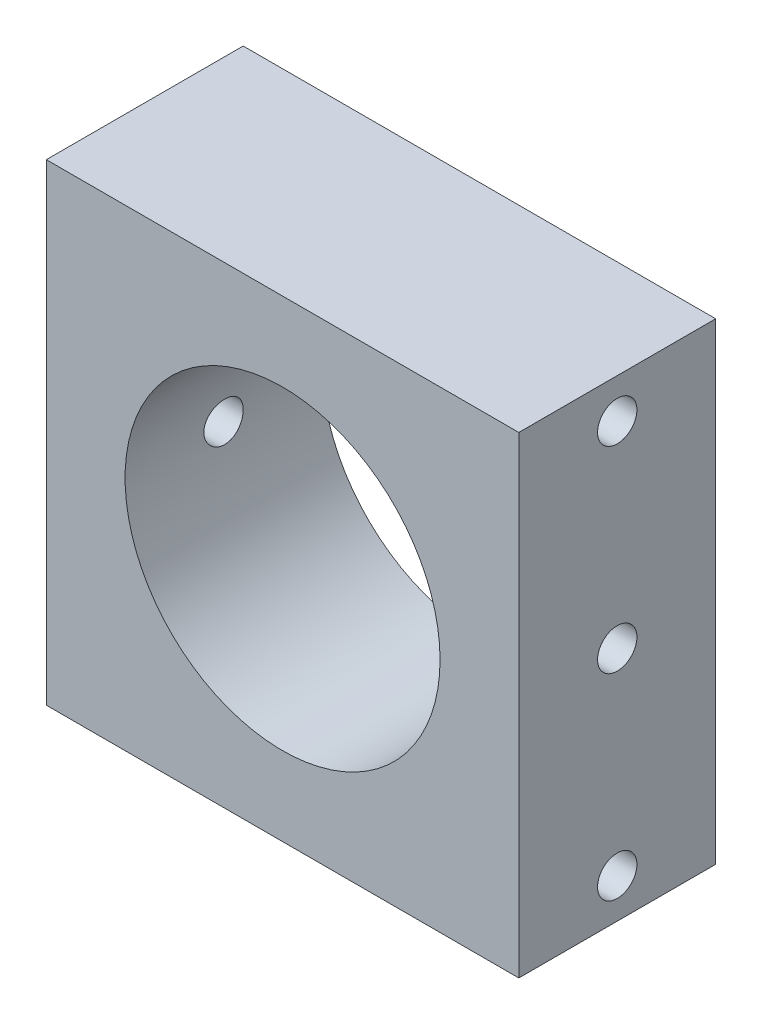
ISO-10303-21;
HEADER;
FILE_DESCRIPTION(('STEP AP214'),'2;1');
FILE_NAME('part.step','',(''),(''),'','','');
FILE_SCHEMA(('AUTOMOTIVE_DESIGN { 1 0 10303 214 1 1 1 1 }'));
ENDSEC;
DATA;
#1=APPLICATION_CONTEXT('core data for automotive mechanical design processes');
#2=APPLICATION_PROTOCOL_DEFINITION('international standard','automotive_design',2000,#1);
#3=PRODUCT_CONTEXT('',#1,'mechanical');
#4=PRODUCT('Part','Part','',(#3));
#5=PRODUCT_RELATED_PRODUCT_CATEGORY('part','',(#4));
#6=PRODUCT_DEFINITION_FORMATION('','',#4);
#7=PRODUCT_DEFINITION_CONTEXT('part definition',#1,'design');
#8=PRODUCT_DEFINITION('design','',#6,#7);
#9=PRODUCT_DEFINITION_SHAPE('','',#8);
#10=(LENGTH_UNIT() NAMED_UNIT(*) SI_UNIT(.MILLI.,.METRE.));
#11=(NAMED_UNIT(*) PLANE_ANGLE_UNIT() SI_UNIT($,.RADIAN.));
#12=(NAMED_UNIT(*) SI_UNIT($,.STERADIAN.) SOLID_ANGLE_UNIT());
#13=UNCERTAINTY_MEASURE_WITH_UNIT(LENGTH_MEASURE(1.E-05),#10,'distance_accuracy_value','');
#14=(GEOMETRIC_REPRESENTATION_CONTEXT(3) GLOBAL_UNCERTAINTY_ASSIGNED_CONTEXT((#13)) GLOBAL_UNIT_ASSIGNED_CONTEXT((#10,
#11,#12)) REPRESENTATION_CONTEXT('',''));
#15=CARTESIAN_POINT('',(0.,0.,0.));
#16=DIRECTION('',(0.,0.,1.));
#17=DIRECTION('',(1.,0.,0.));
#18=AXIS2_PLACEMENT_3D('',#15,#16,#17);
#19=CARTESIAN_POINT('',(0.,-30.,25.));
#20=DIRECTION('',(0.,1.,0.));
#21=DIRECTION('',(0.,0.,1.));
#22=AXIS2_PLACEMENT_3D('',#19,#20,#21);
#23=PLANE('',#22);
#24=DIRECTION('',(1.,0.,0.));
#25=VECTOR('',#24,1.);
#26=CARTESIAN_POINT('',(0.,-30.,0.));
#27=LINE('',#26,#25);
#28=CARTESIAN_POINT('',(-30.,-30.,0.));
#29=VERTEX_POINT('',#28);
#30=CARTESIAN_POINT('',(30.,-30.,0.));
#31=VERTEX_POINT('',#30);
#32=EDGE_CURVE('E120',#29,#31,#27,.T.);
#33=ORIENTED_EDGE('',*,*,#32,.T.);
#34=DIRECTION('',(0.,0.,-1.));
#35=VECTOR('',#34,1.);
#36=CARTESIAN_POINT('',(30.,-30.,25.));
#37=LINE('',#36,#35);
#38=CARTESIAN_POINT('',(30.,-30.,25.));
#39=VERTEX_POINT('',#38);
#40=EDGE_CURVE('E11',#39,#31,#37,.T.);
#41=ORIENTED_EDGE('',*,*,#40,.F.);
#42=DIRECTION('',(1.,0.,0.));
#43=VECTOR('',#42,1.);
#44=CARTESIAN_POINT('',(0.,-30.,25.));
#45=LINE('',#44,#43);
#46=CARTESIAN_POINT('',(-30.,-30.,25.));
#47=VERTEX_POINT('',#46);
#48=EDGE_CURVE('E102',#47,#39,#45,.T.);
#49=ORIENTED_EDGE('',*,*,#48,.F.);
#50=DIRECTION('',(0.,0.,-1.));
#51=VECTOR('',#50,1.);
#52=CARTESIAN_POINT('',(-30.,-30.,25.));
#53=LINE('',#52,#51);
#54=EDGE_CURVE('E68',#47,#29,#53,.T.);
#55=ORIENTED_EDGE('',*,*,#54,.T.);
#56=EDGE_LOOP('',(#33,#41,#49,#55));
#57=FACE_BOUND('',#56,.T.);
#58=ADVANCED_FACE('F45',(#57),#23,.F.);
#59=CARTESIAN_POINT('',(30.,0.,25.));
#60=DIRECTION('',(-1.,0.,0.));
#61=DIRECTION('',(0.,0.,1.));
#62=AXIS2_PLACEMENT_3D('',#59,#60,#61);
#63=PLANE('',#62);
#64=CARTESIAN_POINT('',(30.,25.,12.5));
#65=DIRECTION('',(1.,0.,0.));
#66=DIRECTION('',(0.,0.,-1.));
#67=AXIS2_PLACEMENT_3D('',#64,#65,#66);
#68=CIRCLE('',#67,2.5);
#69=CARTESIAN_POINT('',(30.,25.,10.));
#70=VERTEX_POINT('',#69);
#71=EDGE_CURVE('E193',#70,#70,#68,.T.);
#72=ORIENTED_EDGE('',*,*,#71,.F.);
#73=EDGE_LOOP('',(#72));
#74=FACE_BOUND('',#73,.T.);
#75=CARTESIAN_POINT('',(30.,-25.,12.5));
#76=DIRECTION('',(1.,0.,0.));
#77=DIRECTION('',(0.,0.,-1.));
#78=AXIS2_PLACEMENT_3D('',#75,#76,#77);
#79=CIRCLE('',#78,2.5);
#80=CARTESIAN_POINT('',(30.,-25.,9.99999999999999));
#81=VERTEX_POINT('',#80);
#82=EDGE_CURVE('E190',#81,#81,#79,.T.);
#83=ORIENTED_EDGE('',*,*,#82,.F.);
#84=EDGE_LOOP('',(#83));
#85=FACE_BOUND('',#84,.T.);
#86=CARTESIAN_POINT('',(30.,0.,12.5));
#87=DIRECTION('',(1.,0.,0.));
#88=DIRECTION('',(0.,0.,-1.));
#89=AXIS2_PLACEMENT_3D('',#86,#87,#88);
#90=CIRCLE('',#89,2.5);
#91=CARTESIAN_POINT('',(30.,0.,10.));
#92=VERTEX_POINT('',#91);
#93=EDGE_CURVE('E184',#92,#92,#90,.T.);
#94=ORIENTED_EDGE('',*,*,#93,.F.);
#95=EDGE_LOOP('',(#94));
#96=FACE_BOUND('',#95,.T.);
#97=DIRECTION('',(0.,1.,0.));
#98=VECTOR('',#97,1.);
#99=CARTESIAN_POINT('',(30.,0.,0.));
#100=LINE('',#99,#98);
#101=CARTESIAN_POINT('',(30.,30.,0.));
#102=VERTEX_POINT('',#101);
#103=EDGE_CURVE('E107',#31,#102,#100,.T.);
#104=ORIENTED_EDGE('',*,*,#103,.T.);
#105=DIRECTION('',(0.,0.,-1.));
#106=VECTOR('',#105,1.);
#107=CARTESIAN_POINT('',(30.,30.,25.));
#108=LINE('',#107,#106);
#109=CARTESIAN_POINT('',(30.,30.,25.));
#110=VERTEX_POINT('',#109);
#111=EDGE_CURVE('E59',#110,#102,#108,.T.);
#112=ORIENTED_EDGE('',*,*,#111,.F.);
#113=DIRECTION('',(0.,1.,0.));
#114=VECTOR('',#113,1.);
#115=CARTESIAN_POINT('',(30.,0.,25.));
#116=LINE('',#115,#114);
#117=EDGE_CURVE('E93',#39,#110,#116,.T.);
#118=ORIENTED_EDGE('',*,*,#117,.F.);
#119=ORIENTED_EDGE('',*,*,#40,.T.);
#120=EDGE_LOOP('',(#104,#112,#118,#119));
#121=FACE_BOUND('',#120,.T.);
#122=ADVANCED_FACE('F106',(#74,#85,#96,#121),#63,.F.);
#123=CARTESIAN_POINT('',(0.,30.,25.));
#124=DIRECTION('',(0.,1.,0.));
#125=DIRECTION('',(0.,0.,1.));
#126=AXIS2_PLACEMENT_3D('',#123,#124,#125);
#127=PLANE('',#126);
#128=DIRECTION('',(1.,0.,0.));
#129=VECTOR('',#128,1.);
#130=CARTESIAN_POINT('',(0.,30.,0.));
#131=LINE('',#130,#129);
#132=CARTESIAN_POINT('',(-30.,30.,0.));
#133=VERTEX_POINT('',#132);
#134=EDGE_CURVE('E123',#133,#102,#131,.T.);
#135=ORIENTED_EDGE('',*,*,#134,.F.);
#136=DIRECTION('',(0.,0.,-1.));
#137=VECTOR('',#136,1.);
#138=CARTESIAN_POINT('',(-30.,30.,25.));
#139=LINE('',#138,#137);
#140=CARTESIAN_POINT('',(-30.,30.,25.));
#141=VERTEX_POINT('',#140);
#142=EDGE_CURVE('E82',#141,#133,#139,.T.);
#143=ORIENTED_EDGE('',*,*,#142,.F.);
#144=DIRECTION('',(1.,0.,0.));
#145=VECTOR('',#144,1.);
#146=CARTESIAN_POINT('',(0.,30.,25.));
#147=LINE('',#146,#145);
#148=EDGE_CURVE('E101',#141,#110,#147,.T.);
#149=ORIENTED_EDGE('',*,*,#148,.T.);
#150=ORIENTED_EDGE('',*,*,#111,.T.);
#151=EDGE_LOOP('',(#135,#143,#149,#150));
#152=FACE_BOUND('',#151,.T.);
#153=ADVANCED_FACE('F111',(#152),#127,.T.);
#154=CARTESIAN_POINT('',(-30.,0.,25.));
#155=DIRECTION('',(-1.,0.,0.));
#156=DIRECTION('',(0.,0.,1.));
#157=AXIS2_PLACEMENT_3D('',#154,#155,#156);
#158=PLANE('',#157);
#159=CARTESIAN_POINT('',(-30.,25.,12.5));
#160=DIRECTION('',(1.,0.,0.));
#161=DIRECTION('',(0.,0.,-1.));
#162=AXIS2_PLACEMENT_3D('',#159,#160,#161);
#163=CIRCLE('',#162,2.5);
#164=CARTESIAN_POINT('',(-30.,25.,10.));
#165=VERTEX_POINT('',#164);
#166=EDGE_CURVE('E137',#165,#165,#163,.T.);
#167=ORIENTED_EDGE('',*,*,#166,.T.);
#168=EDGE_LOOP('',(#167));
#169=FACE_BOUND('',#168,.T.);
#170=CARTESIAN_POINT('',(-30.,-25.,12.5));
#171=DIRECTION('',(1.,0.,0.));
#172=DIRECTION('',(0.,0.,-1.));
#173=AXIS2_PLACEMENT_3D('',#170,#171,#172);
#174=CIRCLE('',#173,2.5);
#175=CARTESIAN_POINT('',(-30.,-25.,9.99999999999999));
#176=VERTEX_POINT('',#175);
#177=EDGE_CURVE('E179',#176,#176,#174,.T.);
#178=ORIENTED_EDGE('',*,*,#177,.T.);
#179=EDGE_LOOP('',(#178));
#180=FACE_BOUND('',#179,.T.);
#181=CARTESIAN_POINT('',(-30.,0.,12.5));
#182=DIRECTION('',(1.,0.,0.));
#183=DIRECTION('',(0.,0.,-1.));
#184=AXIS2_PLACEMENT_3D('',#181,#182,#183);
#185=CIRCLE('',#184,2.5);
#186=CARTESIAN_POINT('',(-30.,0.,10.));
#187=VERTEX_POINT('',#186);
#188=EDGE_CURVE('E182',#187,#187,#185,.T.);
#189=ORIENTED_EDGE('',*,*,#188,.T.);
#190=EDGE_LOOP('',(#189));
#191=FACE_BOUND('',#190,.T.);
#192=DIRECTION('',(0.,1.,0.));
#193=VECTOR('',#192,1.);
#194=CARTESIAN_POINT('',(-30.,0.,0.));
#195=LINE('',#194,#193);
#196=EDGE_CURVE('E125',#29,#133,#195,.T.);
#197=ORIENTED_EDGE('',*,*,#196,.F.);
#198=ORIENTED_EDGE('',*,*,#54,.F.);
#199=DIRECTION('',(0.,1.,0.));
#200=VECTOR('',#199,1.);
#201=CARTESIAN_POINT('',(-30.,0.,25.));
#202=LINE('',#201,#200);
#203=EDGE_CURVE('E112',#47,#141,#202,.T.);
#204=ORIENTED_EDGE('',*,*,#203,.T.);
#205=ORIENTED_EDGE('',*,*,#142,.T.);
#206=EDGE_LOOP('',(#197,#198,#204,#205));
#207=FACE_BOUND('',#206,.T.);
#208=ADVANCED_FACE('F165',(#169,#180,#191,#207),#158,.T.);
#209=CARTESIAN_POINT('',(0.,0.,25.));
#210=DIRECTION('',(0.,0.,-1.));
#211=DIRECTION('',(-1.,0.,0.));
#212=AXIS2_PLACEMENT_3D('',#209,#210,#211);
#213=CYLINDRICAL_SURFACE('',#212,20.);
#214=CARTESIAN_POINT('',(-20.,0.,15.));
#215=CARTESIAN_POINT('',(-19.9999980489643,-0.139841095555761,14.9999940590643));
#216=CARTESIAN_POINT('',(-19.998517845549,-0.279769574302747,14.9882271208307));
#217=CARTESIAN_POINT('',(-19.9927554011136,-0.555732802089753,14.9414722454292));
#218=CARTESIAN_POINT('',(-19.9884702344143,-0.691763330623745,14.9064600620766));
#219=CARTESIAN_POINT('',(-19.9775806104441,-0.955895574813054,14.8142623560859));
#220=CARTESIAN_POINT('',(-19.9709777145554,-1.08400256014614,14.7570917581901));
#221=CARTESIAN_POINT('',(-19.956187008781,-1.32877947489304,14.6222327160302));
#222=CARTESIAN_POINT('',(-19.9479994708412,-1.44545136155637,14.5445477914693));
#223=CARTESIAN_POINT('',(-19.9309032130632,-1.66471281693132,14.3704080501604));
#224=CARTESIAN_POINT('',(-19.9219911469242,-1.76723036493713,14.2738628706538));
#225=CARTESIAN_POINT('',(-19.9044772600975,-1.95465279355749,14.0649371764634));
#226=CARTESIAN_POINT('',(-19.8958754552427,-2.03955677639225,13.9525558550868));
#227=CARTESIAN_POINT('',(-19.8799230561958,-2.18961016128394,13.7146800224343));
#228=CARTESIAN_POINT('',(-19.8725767717791,-2.25469209594107,13.5891426384321));
#229=CARTESIAN_POINT('',(-19.8600112845768,-2.36282307657512,13.3288129480526));
#230=CARTESIAN_POINT('',(-19.8547920011313,-2.40587295806522,13.194020992853));
#231=CARTESIAN_POINT('',(-19.8471033960361,-2.46849898002476,12.9197558044132));
#232=CARTESIAN_POINT('',(-19.8446198343674,-2.4881967147317,12.7803107422958));
#233=CARTESIAN_POINT('',(-19.8426402814279,-2.50393554955723,12.5000737365282));
#234=CARTESIAN_POINT('',(-19.8431441700151,-2.49997760100242,12.3592818472687));
#235=CARTESIAN_POINT('',(-19.8470695536975,-2.4686172364479,12.0811951727512));
#236=CARTESIAN_POINT('',(-19.8504743796033,-2.4413487629847,11.9438850137997));
#237=CARTESIAN_POINT('',(-19.8597919975763,-2.36435038318205,11.675804978781));
#238=CARTESIAN_POINT('',(-19.8657048404572,-2.3146200217519,11.545035235286));
#239=CARTESIAN_POINT('',(-19.8793911586465,-2.19396555991165,11.2933320009783));
#240=CARTESIAN_POINT('',(-19.8871697321144,-2.12298325370764,11.172426699751));
#241=CARTESIAN_POINT('',(-19.903707114306,-1.96188146945692,10.9441933055868));
#242=CARTESIAN_POINT('',(-19.9124659678566,-1.87176111608078,10.8368658340263));
#243=CARTESIAN_POINT('',(-19.9300510989042,-1.67419911075378,10.6380572892773));
#244=CARTESIAN_POINT('',(-19.9388774238689,-1.56664200784001,10.546690908234));
#245=CARTESIAN_POINT('',(-19.9555463255585,-1.33765716911392,10.3832911199695));
#246=CARTESIAN_POINT('',(-19.963388900015,-1.21622940131825,10.311257757328));
#247=CARTESIAN_POINT('',(-19.9772115221858,-0.962861671363481,10.1885686795361));
#248=CARTESIAN_POINT('',(-19.9831909440154,-0.830918195337716,10.1379201461188));
#249=CARTESIAN_POINT('',(-19.9926078578006,-0.560307940431055,10.0595295064767));
#250=CARTESIAN_POINT('',(-19.9960454687587,-0.421641476630666,10.031786327863));
#251=CARTESIAN_POINT('',(-19.9999759641076,-0.142513163913497,10.0001425757394));
#252=CARTESIAN_POINT('',(-20.0004883614263,-0.00206949019860642,9.99608400763593));
#253=CARTESIAN_POINT('',(-19.9985633800543,0.277496036497497,10.011507734056));
#254=CARTESIAN_POINT('',(-19.9961260641821,0.416617917564707,10.0309895272516));
#255=CARTESIAN_POINT('',(-19.9885876875669,0.689124507721523,10.0928097087744));
#256=CARTESIAN_POINT('',(-19.9834954081387,0.822526570424706,10.1350727634026));
#257=CARTESIAN_POINT('',(-19.971217231002,1.08034965485841,10.2411774519129));
#258=CARTESIAN_POINT('',(-19.9640312622062,1.20477037146531,10.3050198184914));
#259=CARTESIAN_POINT('',(-19.9483182291011,1.44180452068743,10.4528531375075));
#260=CARTESIAN_POINT('',(-19.9397844404251,1.55435375994382,10.5369462898056));
#261=CARTESIAN_POINT('',(-19.9223514232566,1.76379698962632,10.7227494975342));
#262=CARTESIAN_POINT('',(-19.913452180269,1.86069035833686,10.824460252251));
#263=CARTESIAN_POINT('',(-19.8962310546258,2.03663195881802,11.0433074167571));
#264=CARTESIAN_POINT('',(-19.8879127472133,2.11557546056793,11.1605283463104));
#265=CARTESIAN_POINT('',(-19.8728541103715,2.25265288944351,11.4066582448547));
#266=CARTESIAN_POINT('',(-19.8661137493103,2.31078723372837,11.5355669794765));
#267=CARTESIAN_POINT('',(-19.8549985039299,2.40442657886654,11.8010753191476));
#268=CARTESIAN_POINT('',(-19.8506174518479,2.43999062745711,11.937653830048));
#269=CARTESIAN_POINT('',(-19.8446991590745,2.48766999386785,12.2149024837807));
#270=CARTESIAN_POINT('',(-19.8431617860878,2.49978640253576,12.355572435959));
#271=CARTESIAN_POINT('',(-19.8431087698245,2.50020653608484,12.6359689292047));
#272=CARTESIAN_POINT('',(-19.8445722475195,2.48867479769927,12.7756952483319));
#273=CARTESIAN_POINT('',(-19.850311145372,2.44247440484933,13.0512071293451));
#274=CARTESIAN_POINT('',(-19.8545865658308,2.40780574790577,13.1869926908088));
#275=CARTESIAN_POINT('',(-19.8654611577455,2.31636707368966,13.4507469567664));
#276=CARTESIAN_POINT('',(-19.8720594959278,2.25960498097093,13.5787184450218));
#277=CARTESIAN_POINT('',(-19.8868378324482,2.12560690215031,13.8233466540483));
#278=CARTESIAN_POINT('',(-19.8950178506041,2.04837065950959,13.9400032330198));
#279=CARTESIAN_POINT('',(-19.9121060475223,1.87500633126584,14.1595312253405));
#280=CARTESIAN_POINT('',(-19.9210187208403,1.77875562577496,14.262305460955));
#281=CARTESIAN_POINT('',(-19.938528315929,1.57035022696838,14.450306825168));
#282=CARTESIAN_POINT('',(-19.9471251627559,1.45819178914157,14.5355298107743));
#283=CARTESIAN_POINT('',(-19.9630705658675,1.22066562085421,14.6862853571053));
#284=CARTESIAN_POINT('',(-19.970414250783,1.09524927959617,14.7517418058993));
#285=CARTESIAN_POINT('',(-19.9829764907672,0.835182902301281,14.8605712429163));
#286=CARTESIAN_POINT('',(-19.9881973536957,0.700543080870236,14.9039682263535));
#287=CARTESIAN_POINT('',(-19.9946672032774,0.471005771967925,14.9570593381713));
#288=CARTESIAN_POINT('',(-19.9966572589545,0.377555663516921,14.9731389419821));
#289=CARTESIAN_POINT('',(-19.9993243132919,0.189417063212436,14.9946112456932));
#290=CARTESIAN_POINT('',(-20.0000013216347,0.0947285804960276,15.0000040243993));
#291=CARTESIAN_POINT('',(-20.,0.,15.));
#292=B_SPLINE_CURVE_WITH_KNOTS('',3,(#214,#215,#216,#217,#218,#219,#220,#221,#222,#223,#224,
#225,#226,#227,#228,#229,#230,#231,#232,#233,#234,#235,#236,#237,#238,#239,#240,#241,#242,#243,
#244,#245,#246,#247,#248,#249,#250,#251,#252,#253,#254,#255,#256,#257,#258,#259,#260,#261,#262,
#263,#264,#265,#266,#267,#268,#269,#270,#271,#272,#273,#274,#275,#276,#277,#278,#279,#280,#281,
#282,#283,#284,#285,#286,#287,#288,#289,#290,#291),.UNSPECIFIED.,.T.,.F.,(4,2,2,2,2,2,2,2,2,2,2,
2,2,2,2,2,2,2,2,2,2,2,2,2,2,2,2,2,2,2,2,2,2,2,2,2,2,2,4),(0.,0.419177272776247,
0.838792460943427,1.25812550818177,1.67738665591073,2.09870813201843,2.52005107800011,
2.94281250318869,3.36555789496807,3.78609225286321,4.20660969884664,4.62472696441692,
5.04285270166241,5.46213426285534,5.88143500513639,6.30363478136417,6.72583553113114,
7.14817795731605,7.57050060903781,7.99000279391921,8.40949604501929,8.82761053893396,
9.24573923078948,9.66602402928422,10.0863255137509,10.5090197150757,10.9317054422154,
11.3532807428093,11.7748364301062,12.1934690120222,12.6121016387955,13.0305842470649,
13.4490720991226,13.8703523769183,14.2917319847001,14.7147140303685,15.1372349868403,
15.4211884318763,15.7051397830044),.UNSPECIFIED.);
#293=CARTESIAN_POINT('',(-20.,0.,15.));
#294=VERTEX_POINT('',#293);
#295=EDGE_CURVE('E48',#294,#294,#292,.T.);
#296=ORIENTED_EDGE('',*,*,#295,.F.);
#297=EDGE_LOOP('',(#296));
#298=FACE_BOUND('',#297,.T.);
#299=CARTESIAN_POINT('',(20.,0.,10.));
#300=CARTESIAN_POINT('',(19.9999980489643,-0.139841095555761,10.0000059409357));
#301=CARTESIAN_POINT('',(19.998517845549,-0.279769574302747,10.0117728791693));
#302=CARTESIAN_POINT('',(19.9927554011136,-0.555732802089753,10.0585277545708));
#303=CARTESIAN_POINT('',(19.9884702344143,-0.691763330623745,10.0935399379234));
#304=CARTESIAN_POINT('',(19.9775806104441,-0.955895574813054,10.1857376439141));
#305=CARTESIAN_POINT('',(19.9709777145554,-1.08400256014614,10.2429082418099));
#306=CARTESIAN_POINT('',(19.956187008781,-1.32877947489304,10.3777672839698));
#307=CARTESIAN_POINT('',(19.9479994708412,-1.44545136155637,10.4554522085307));
#308=CARTESIAN_POINT('',(19.9309032130632,-1.66471281693132,10.6295919498396));
#309=CARTESIAN_POINT('',(19.9219911469242,-1.76723036493713,10.7261371293462));
#310=CARTESIAN_POINT('',(19.9044772600975,-1.95465279355749,10.9350628235366));
#311=CARTESIAN_POINT('',(19.8958754552427,-2.03955677639225,11.0474441449132));
#312=CARTESIAN_POINT('',(19.8799230561958,-2.18961016128394,11.2853199775657));
#313=CARTESIAN_POINT('',(19.8725767717791,-2.25469209594107,11.4108573615679));
#314=CARTESIAN_POINT('',(19.8600112845768,-2.36282307657512,11.6711870519474));
#315=CARTESIAN_POINT('',(19.8547920011313,-2.40587295806522,11.805979007147));
#316=CARTESIAN_POINT('',(19.8471033960361,-2.46849898002476,12.0802441955868));
#317=CARTESIAN_POINT('',(19.8446198343674,-2.4881967147317,12.2196892577042));
#318=CARTESIAN_POINT('',(19.8426402814279,-2.50393554955723,12.4999262634718));
#319=CARTESIAN_POINT('',(19.8431441700151,-2.49997760100242,12.6407181527313));
#320=CARTESIAN_POINT('',(19.8470695536975,-2.4686172364479,12.9188048272488));
#321=CARTESIAN_POINT('',(19.8504743796033,-2.4413487629847,13.0561149862003));
#322=CARTESIAN_POINT('',(19.8597919975763,-2.36435038318205,13.324195021219));
#323=CARTESIAN_POINT('',(19.8657048404572,-2.3146200217519,13.454964764714));
#324=CARTESIAN_POINT('',(19.8793911586465,-2.19396555991165,13.7066679990217));
#325=CARTESIAN_POINT('',(19.8871697321144,-2.12298325370764,13.827573300249));
#326=CARTESIAN_POINT('',(19.903707114306,-1.96188146945692,14.0558066944132));
#327=CARTESIAN_POINT('',(19.9124659678566,-1.87176111608078,14.1631341659737));
#328=CARTESIAN_POINT('',(19.9300510989042,-1.67419911075378,14.3619427107227));
#329=CARTESIAN_POINT('',(19.9388774238689,-1.56664200784001,14.453309091766));
#330=CARTESIAN_POINT('',(19.9555463255585,-1.33765716911392,14.6167088800305));
#331=CARTESIAN_POINT('',(19.963388900015,-1.21622940131825,14.688742242672));
#332=CARTESIAN_POINT('',(19.9772115221858,-0.962861671363481,14.8114313204639));
#333=CARTESIAN_POINT('',(19.9831909440154,-0.830918195337716,14.8620798538812));
#334=CARTESIAN_POINT('',(19.9926078578006,-0.560307940431055,14.9404704935233));
#335=CARTESIAN_POINT('',(19.9960454687587,-0.421641476630666,14.9682136721371));
#336=CARTESIAN_POINT('',(19.9999759641076,-0.142513163913497,14.9998574242606));
#337=CARTESIAN_POINT('',(20.0004883614263,-0.00206949019860645,15.0039159923641));
#338=CARTESIAN_POINT('',(19.9985633800543,0.277496036497497,14.988492265944));
#339=CARTESIAN_POINT('',(19.9961260641821,0.416617917564707,14.9690104727484));
#340=CARTESIAN_POINT('',(19.9885876875669,0.689124507721522,14.9071902912256));
#341=CARTESIAN_POINT('',(19.9834954081387,0.822526570424705,14.8649272365974));
#342=CARTESIAN_POINT('',(19.971217231002,1.08034965485841,14.7588225480871));
#343=CARTESIAN_POINT('',(19.9640312622062,1.20477037146531,14.6949801815086));
#344=CARTESIAN_POINT('',(19.9483182291011,1.44180452068743,14.5471468624925));
#345=CARTESIAN_POINT('',(19.9397844404251,1.55435375994382,14.4630537101944));
#346=CARTESIAN_POINT('',(19.9223514232566,1.76379698962632,14.2772505024658));
#347=CARTESIAN_POINT('',(19.913452180269,1.86069035833686,14.175539747749));
#348=CARTESIAN_POINT('',(19.8962310546258,2.03663195881802,13.9566925832429));
#349=CARTESIAN_POINT('',(19.8879127472133,2.11557546056793,13.8394716536896));
#350=CARTESIAN_POINT('',(19.8728541103715,2.25265288944351,13.5933417551453));
#351=CARTESIAN_POINT('',(19.8661137493103,2.31078723372837,13.4644330205235));
#352=CARTESIAN_POINT('',(19.8549985039299,2.40442657886654,13.1989246808524));
#353=CARTESIAN_POINT('',(19.8506174518479,2.43999062745711,13.062346169952));
#354=CARTESIAN_POINT('',(19.8446991590745,2.48766999386785,12.7850975162193));
#355=CARTESIAN_POINT('',(19.8431617860878,2.49978640253576,12.644427564041));
#356=CARTESIAN_POINT('',(19.8431087698245,2.50020653608484,12.3640310707953));
#357=CARTESIAN_POINT('',(19.8445722475195,2.48867479769927,12.2243047516681));
#358=CARTESIAN_POINT('',(19.850311145372,2.44247440484933,11.9487928706549));
#359=CARTESIAN_POINT('',(19.8545865658308,2.40780574790577,11.8130073091912));
#360=CARTESIAN_POINT('',(19.8654611577455,2.31636707368966,11.5492530432336));
#361=CARTESIAN_POINT('',(19.8720594959278,2.25960498097093,11.4212815549782));
#362=CARTESIAN_POINT('',(19.8868378324482,2.12560690215031,11.1766533459517));
#363=CARTESIAN_POINT('',(19.8950178506041,2.04837065950959,11.0599967669802));
#364=CARTESIAN_POINT('',(19.9121060475223,1.87500633126584,10.8404687746595));
#365=CARTESIAN_POINT('',(19.9210187208403,1.77875562577496,10.737694539045));
#366=CARTESIAN_POINT('',(19.938528315929,1.57035022696838,10.549693174832));
#367=CARTESIAN_POINT('',(19.9471251627559,1.45819178914157,10.4644701892257));
#368=CARTESIAN_POINT('',(19.9630705658675,1.22066562085421,10.3137146428947));
#369=CARTESIAN_POINT('',(19.970414250783,1.09524927959617,10.2482581941007));
#370=CARTESIAN_POINT('',(19.9829764907672,0.835182902301281,10.1394287570837));
#371=CARTESIAN_POINT('',(19.9881973536957,0.700543080870236,10.0960317736465));
#372=CARTESIAN_POINT('',(19.9946672032774,0.471005771967925,10.0429406618287));
#373=CARTESIAN_POINT('',(19.9966572589545,0.377555663516921,10.0268610580179));
#374=CARTESIAN_POINT('',(19.9993243132919,0.189417063212436,10.0053887543068));
#375=CARTESIAN_POINT('',(20.0000013216347,0.0947285804960276,9.9999959756007));
#376=CARTESIAN_POINT('',(20.,0.,10.));
#377=B_SPLINE_CURVE_WITH_KNOTS('',3,(#299,#300,#301,#302,#303,#304,#305,#306,#307,#308,#309,
#310,#311,#312,#313,#314,#315,#316,#317,#318,#319,#320,#321,#322,#323,#324,#325,#326,#327,#328,
#329,#330,#331,#332,#333,#334,#335,#336,#337,#338,#339,#340,#341,#342,#343,#344,#345,#346,#347,
#348,#349,#350,#351,#352,#353,#354,#355,#356,#357,#358,#359,#360,#361,#362,#363,#364,#365,#366,
#367,#368,#369,#370,#371,#372,#373,#374,#375,#376),.UNSPECIFIED.,.T.,.F.,(4,2,2,2,2,2,2,2,2,2,2,
2,2,2,2,2,2,2,2,2,2,2,2,2,2,2,2,2,2,2,2,2,2,2,2,2,2,2,4),(0.,0.419177272776247,
0.838792460943427,1.25812550818177,1.67738665591073,2.09870813201843,2.52005107800011,
2.94281250318869,3.36555789496807,3.78609225286321,4.20660969884664,4.62472696441692,
5.04285270166241,5.46213426285534,5.88143500513639,6.30363478136417,6.72583553113114,
7.14817795731605,7.5705006090378,7.99000279391921,8.40949604501929,8.82761053893396,
9.24573923078948,9.66602402928423,10.0863255137509,10.5090197150757,10.9317054422154,
11.3532807428092,11.7748364301062,12.1934690120222,12.6121016387955,13.0305842470649,
13.4490720991226,13.8703523769183,14.2917319847001,14.7147140303685,15.1372349868403,
15.4211884318763,15.7051397830044),.UNSPECIFIED.);
#378=CARTESIAN_POINT('',(20.,0.,10.));
#379=VERTEX_POINT('',#378);
#380=EDGE_CURVE('E132',#379,#379,#377,.T.);
#381=ORIENTED_EDGE('',*,*,#380,.F.);
#382=EDGE_LOOP('',(#381));
#383=FACE_BOUND('',#382,.T.);
#384=CARTESIAN_POINT('',(0.,0.,25.));
#385=DIRECTION('',(0.,0.,1.));
#386=DIRECTION('',(1.,0.,0.));
#387=AXIS2_PLACEMENT_3D('',#384,#385,#386);
#388=CIRCLE('',#387,20.);
#389=CARTESIAN_POINT('',(20.,0.,25.));
#390=VERTEX_POINT('',#389);
#391=EDGE_CURVE('E114',#390,#390,#388,.T.);
#392=ORIENTED_EDGE('',*,*,#391,.T.);
#393=EDGE_LOOP('',(#392));
#394=FACE_BOUND('',#393,.T.);
#395=CARTESIAN_POINT('',(0.,0.,0.));
#396=DIRECTION('',(0.,0.,1.));
#397=DIRECTION('',(1.,0.,0.));
#398=AXIS2_PLACEMENT_3D('',#395,#396,#397);
#399=CIRCLE('',#398,20.);
#400=CARTESIAN_POINT('',(20.,0.,0.));
#401=VERTEX_POINT('',#400);
#402=EDGE_CURVE('E128',#401,#401,#399,.T.);
#403=ORIENTED_EDGE('',*,*,#402,.F.);
#404=EDGE_LOOP('',(#403));
#405=FACE_BOUND('',#404,.T.);
#406=ADVANCED_FACE('F138',(#298,#383,#394,#405),#213,.F.);
#407=CARTESIAN_POINT('',(0.,0.,25.));
#408=DIRECTION('',(0.,0.,1.));
#409=DIRECTION('',(1.,0.,0.));
#410=AXIS2_PLACEMENT_3D('',#407,#408,#409);
#411=PLANE('',#410);
#412=ORIENTED_EDGE('',*,*,#48,.T.);
#413=ORIENTED_EDGE('',*,*,#117,.T.);
#414=ORIENTED_EDGE('',*,*,#148,.F.);
#415=ORIENTED_EDGE('',*,*,#203,.F.);
#416=EDGE_LOOP('',(#412,#413,#414,#415));
#417=FACE_BOUND('',#416,.T.);
#418=ORIENTED_EDGE('',*,*,#391,.F.);
#419=EDGE_LOOP('',(#418));
#420=FACE_BOUND('',#419,.T.);
#421=ADVANCED_FACE('F97',(#417,#420),#411,.T.);
#422=CARTESIAN_POINT('',(0.,0.,0.));
#423=DIRECTION('',(0.,0.,1.));
#424=DIRECTION('',(1.,0.,0.));
#425=AXIS2_PLACEMENT_3D('',#422,#423,#424);
#426=PLANE('',#425);
#427=ORIENTED_EDGE('',*,*,#32,.F.);
#428=ORIENTED_EDGE('',*,*,#196,.T.);
#429=ORIENTED_EDGE('',*,*,#134,.T.);
#430=ORIENTED_EDGE('',*,*,#103,.F.);
#431=EDGE_LOOP('',(#427,#428,#429,#430));
#432=FACE_BOUND('',#431,.T.);
#433=ORIENTED_EDGE('',*,*,#402,.T.);
#434=EDGE_LOOP('',(#433));
#435=FACE_BOUND('',#434,.T.);
#436=ADVANCED_FACE('F148',(#432,#435),#426,.F.);
#437=CARTESIAN_POINT('',(-30.,0.,12.5));
#438=DIRECTION('',(1.,0.,0.));
#439=DIRECTION('',(0.,0.,-1.));
#440=AXIS2_PLACEMENT_3D('',#437,#438,#439);
#441=CYLINDRICAL_SURFACE('',#440,2.5);
#442=ORIENTED_EDGE('',*,*,#380,.T.);
#443=EDGE_LOOP('',(#442));
#444=FACE_BOUND('',#443,.T.);
#445=ORIENTED_EDGE('',*,*,#93,.T.);
#446=EDGE_LOOP('',(#445));
#447=FACE_BOUND('',#446,.T.);
#448=ADVANCED_FACE('F142',(#444,#447),#441,.F.);
#449=ORIENTED_EDGE('',*,*,#295,.T.);
#450=EDGE_LOOP('',(#449));
#451=FACE_BOUND('',#450,.T.);
#452=ORIENTED_EDGE('',*,*,#188,.F.);
#453=EDGE_LOOP('',(#452));
#454=FACE_BOUND('',#453,.T.);
#455=ADVANCED_FACE('F147',(#451,#454),#441,.F.);
#456=CARTESIAN_POINT('',(-30.,-25.,12.5));
#457=DIRECTION('',(1.,0.,0.));
#458=DIRECTION('',(0.,0.,-1.));
#459=AXIS2_PLACEMENT_3D('',#456,#457,#458);
#460=CYLINDRICAL_SURFACE('',#459,2.5);
#461=ORIENTED_EDGE('',*,*,#177,.F.);
#462=EDGE_LOOP('',(#461));
#463=FACE_BOUND('',#462,.T.);
#464=ORIENTED_EDGE('',*,*,#82,.T.);
#465=EDGE_LOOP('',(#464));
#466=FACE_BOUND('',#465,.T.);
#467=ADVANCED_FACE('F150',(#463,#466),#460,.F.);
#468=CARTESIAN_POINT('',(-30.,25.,12.5));
#469=DIRECTION('',(1.,0.,0.));
#470=DIRECTION('',(0.,0.,-1.));
#471=AXIS2_PLACEMENT_3D('',#468,#469,#470);
#472=CYLINDRICAL_SURFACE('',#471,2.5);
#473=ORIENTED_EDGE('',*,*,#166,.F.);
#474=EDGE_LOOP('',(#473));
#475=FACE_BOUND('',#474,.T.);
#476=ORIENTED_EDGE('',*,*,#71,.T.);
#477=EDGE_LOOP('',(#476));
#478=FACE_BOUND('',#477,.T.);
#479=ADVANCED_FACE('F198',(#475,#478),#472,.F.);
#480=CLOSED_SHELL('',(#58,#122,#153,#208,#406,#421,#436,#448,#455,#467,#479));
#481=MANIFOLD_SOLID_BREP('B2',#480);
#482=ADVANCED_BREP_SHAPE_REPRESENTATION('',(#18,#481),#14);
#483=SHAPE_DEFINITION_REPRESENTATION(#9,#482);
ENDSEC;
END-ISO-10303-21;
